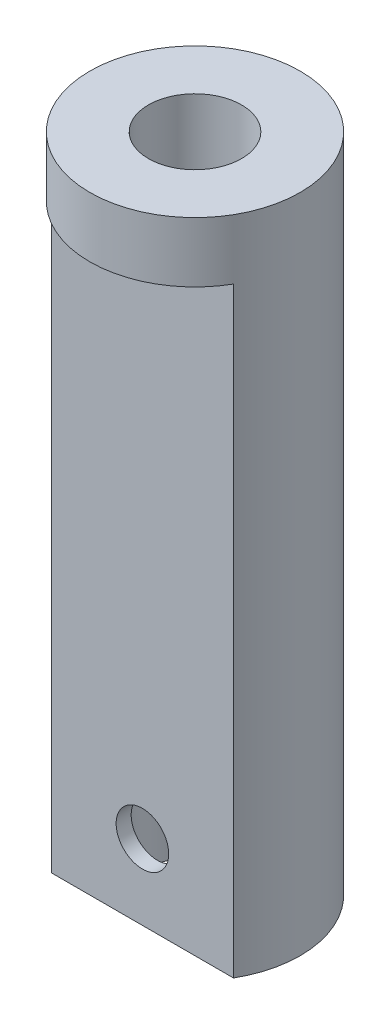
ISO-10303-21;
HEADER;
FILE_DESCRIPTION(('STEP AP214'),'2;1');
FILE_NAME('part.step','',(''),(''),'','','');
FILE_SCHEMA(('AUTOMOTIVE_DESIGN { 1 0 10303 214 1 1 1 1 }'));
ENDSEC;
DATA;
#1=APPLICATION_CONTEXT('core data for automotive mechanical design processes');
#2=APPLICATION_PROTOCOL_DEFINITION('international standard','automotive_design',2000,#1);
#3=PRODUCT_CONTEXT('',#1,'mechanical');
#4=PRODUCT('Part','Part','',(#3));
#5=PRODUCT_RELATED_PRODUCT_CATEGORY('part','',(#4));
#6=PRODUCT_DEFINITION_FORMATION('','',#4);
#7=PRODUCT_DEFINITION_CONTEXT('part definition',#1,'design');
#8=PRODUCT_DEFINITION('design','',#6,#7);
#9=PRODUCT_DEFINITION_SHAPE('','',#8);
#10=(LENGTH_UNIT() NAMED_UNIT(*) SI_UNIT(.MILLI.,.METRE.));
#11=(NAMED_UNIT(*) PLANE_ANGLE_UNIT() SI_UNIT($,.RADIAN.));
#12=(NAMED_UNIT(*) SI_UNIT($,.STERADIAN.) SOLID_ANGLE_UNIT());
#13=UNCERTAINTY_MEASURE_WITH_UNIT(LENGTH_MEASURE(1.E-05),#10,'distance_accuracy_value','');
#14=(GEOMETRIC_REPRESENTATION_CONTEXT(3) GLOBAL_UNCERTAINTY_ASSIGNED_CONTEXT((#13)) GLOBAL_UNIT_ASSIGNED_CONTEXT((#10,
#11,#12)) REPRESENTATION_CONTEXT('',''));
#15=CARTESIAN_POINT('',(0.,0.,0.));
#16=DIRECTION('',(0.,0.,1.));
#17=DIRECTION('',(1.,0.,0.));
#18=AXIS2_PLACEMENT_3D('',#15,#16,#17);
#19=CARTESIAN_POINT('',(0.,30.,0.));
#20=DIRECTION('',(0.,1.,0.));
#21=DIRECTION('',(0.,0.,1.));
#22=AXIS2_PLACEMENT_3D('',#19,#20,#21);
#23=PLANE('',#22);
#24=DIRECTION('',(1.,0.,0.));
#25=VECTOR('',#24,1.);
#26=CARTESIAN_POINT('',(-1.83303027798234,30.,2.5));
#27=LINE('',#26,#25);
#28=CARTESIAN_POINT('',(-1.83303027798234,30.,2.5));
#29=VERTEX_POINT('',#28);
#30=CARTESIAN_POINT('',(1.83303027798234,30.,2.5));
#31=VERTEX_POINT('',#30);
#32=EDGE_CURVE('E115',#29,#31,#27,.T.);
#33=ORIENTED_EDGE('',*,*,#32,.F.);
#34=CARTESIAN_POINT('',(0.,30.,0.));
#35=DIRECTION('',(0.,1.,0.));
#36=DIRECTION('',(0.,0.,1.));
#37=AXIS2_PLACEMENT_3D('',#34,#35,#36);
#38=CIRCLE('',#37,3.1);
#39=EDGE_CURVE('E11',#29,#31,#38,.T.);
#40=ORIENTED_EDGE('',*,*,#39,.T.);
#41=EDGE_LOOP('',(#33,#40));
#42=FACE_BOUND('',#41,.T.);
#43=ADVANCED_FACE('F33',(#42),#23,.T.);
#44=CARTESIAN_POINT('',(0.,30.,0.));
#45=DIRECTION('',(0.,-1.,0.));
#46=DIRECTION('',(0.,0.,-1.));
#47=AXIS2_PLACEMENT_3D('',#44,#45,#46);
#48=CYLINDRICAL_SURFACE('',#47,7.);
#49=CARTESIAN_POINT('',(0.,-3.25,-7.));
#50=CARTESIAN_POINT('',(-0.0966887701146864,-3.25000271336119,-6.99999836512681));
#51=CARTESIAN_POINT('',(-0.193407850802557,-3.25804014256942,-6.99797674487133));
#52=CARTESIAN_POINT('',(-0.384074044398955,-3.28992934319151,-6.99010799468208));
#53=CARTESIAN_POINT('',(-0.478019554682529,-3.31379007779416,-6.9842586965663));
#54=CARTESIAN_POINT('',(-0.660357684213006,-3.37651246237244,-6.96938230720713));
#55=CARTESIAN_POINT('',(-0.74875682400167,-3.41535609850116,-6.96035903315768));
#56=CARTESIAN_POINT('',(-0.917784153888497,-3.50687828838564,-6.94009567775525));
#57=CARTESIAN_POINT('',(-0.998412081740218,-3.55955730880543,-6.92885552163059));
#58=CARTESIAN_POINT('',(-1.15126891518441,-3.67840092126325,-6.90511982523768));
#59=CARTESIAN_POINT('',(-1.22331497173792,-3.74479683745238,-6.89260491673288));
#60=CARTESIAN_POINT('',(-1.35537374840385,-3.8886942390604,-6.86785890137118));
#61=CARTESIAN_POINT('',(-1.41538510977399,-3.96619697677091,-6.8556278266974));
#62=CARTESIAN_POINT('',(-1.52253096659887,-4.13152776452701,-6.83263904982995));
#63=CARTESIAN_POINT('',(-1.56946091857958,-4.21949210261214,-6.82190593549039));
#64=CARTESIAN_POINT('',(-1.64779639330895,-4.40237314693475,-6.80341077280927));
#65=CARTESIAN_POINT('',(-1.67920439801255,-4.49728873888006,-6.79564824951587));
#66=CARTESIAN_POINT('',(-1.72498064293834,-4.68936741456955,-6.78417222837143));
#67=CARTESIAN_POINT('',(-1.73967764638889,-4.78644737872477,-6.7803807292133));
#68=CARTESIAN_POINT('',(-1.75263873757916,-4.98176333051631,-6.77704256294031));
#69=CARTESIAN_POINT('',(-1.75090549878764,-5.07999912748171,-6.77749520523418));
#70=CARTESIAN_POINT('',(-1.73131761207916,-5.27231844236856,-6.78252406412721));
#71=CARTESIAN_POINT('',(-1.71385473022227,-5.36644489170928,-6.78700006835526));
#72=CARTESIAN_POINT('',(-1.66392821805362,-5.55038789272984,-6.79941161289231));
#73=CARTESIAN_POINT('',(-1.63146351908099,-5.64020413686715,-6.80734739965812));
#74=CARTESIAN_POINT('',(-1.55212105759335,-5.81402768562741,-6.82587632888218));
#75=CARTESIAN_POINT('',(-1.50510111177173,-5.89796720042115,-6.83649548714325));
#76=CARTESIAN_POINT('',(-1.39808232201745,-6.05690516138298,-6.8591799598745));
#77=CARTESIAN_POINT('',(-1.33808120694364,-6.1319020394118,-6.87124552723858));
#78=CARTESIAN_POINT('',(-1.20477399546142,-6.2730708849768,-6.89588527296411));
#79=CARTESIAN_POINT('',(-1.1311373011935,-6.33893023840491,-6.90846414390967));
#80=CARTESIAN_POINT('',(-0.973713903754316,-6.45742478287456,-6.9324029317525));
#81=CARTESIAN_POINT('',(-0.889926890659268,-6.51005956997416,-6.94376281140985));
#82=CARTESIAN_POINT('',(-0.714135203461624,-6.60072568392845,-6.96404020776546));
#83=CARTESIAN_POINT('',(-0.622103292076728,-6.63870623029683,-6.97294920149013));
#84=CARTESIAN_POINT('',(-0.432688676166697,-6.6985701899945,-6.98725903156655));
#85=CARTESIAN_POINT('',(-0.3353069990089,-6.72045668248783,-6.99266053895828));
#86=CARTESIAN_POINT('',(-0.140629965455032,-6.74703382648531,-6.99924749149937));
#87=CARTESIAN_POINT('',(-0.0433961733195787,-6.75215019708785,-7.00053729092992));
#88=CARTESIAN_POINT('',(0.150538353935092,-6.74620949760193,-6.99905272283526));
#89=CARTESIAN_POINT('',(0.247239136252027,-6.73515388340101,-6.99627872115488));
#90=CARTESIAN_POINT('',(0.435883313572573,-6.69753394021006,-6.9870451131525));
#91=CARTESIAN_POINT('',(0.527875972130213,-6.67120185927685,-6.9806407321678));
#92=CARTESIAN_POINT('',(0.706133507861262,-6.60404173530015,-6.96486824406489));
#93=CARTESIAN_POINT('',(0.792397805538073,-6.5632122283013,-6.95549983764874));
#94=CARTESIAN_POINT('',(0.958443656834821,-6.46739118297948,-6.93458859247362));
#95=CARTESIAN_POINT('',(1.03808301547513,-6.41216120220378,-6.92301011928087));
#96=CARTESIAN_POINT('',(1.18711438258379,-6.2894117730702,-6.89901927385322));
#97=CARTESIAN_POINT('',(1.25650461880184,-6.22189020378028,-6.88660675793656));
#98=CARTESIAN_POINT('',(1.38482232941818,-6.07449771234813,-6.86197116454233));
#99=CARTESIAN_POINT('',(1.44345117889237,-5.99436434649718,-6.84976021551828));
#100=CARTESIAN_POINT('',(1.54642921884815,-5.82514525979,-6.82725024773445));
#101=CARTESIAN_POINT('',(1.59077904318426,-5.73605993654696,-6.8169511441153));
#102=CARTESIAN_POINT('',(1.66360999071084,-5.55194332385141,-6.79954443857109));
#103=CARTESIAN_POINT('',(1.69218512942974,-5.45695110026532,-6.79241797840557));
#104=CARTESIAN_POINT('',(1.73290326994607,-5.26330542246271,-6.78214534771881));
#105=CARTESIAN_POINT('',(1.74504986539177,-5.16465277379543,-6.77899830673259));
#106=CARTESIAN_POINT('',(1.75237835538966,-4.96952547216893,-6.77710718071283));
#107=CARTESIAN_POINT('',(1.74803754741014,-4.87306965902115,-6.77823921516308));
#108=CARTESIAN_POINT('',(1.72360682469834,-4.68231212988736,-6.78449227175816));
#109=CARTESIAN_POINT('',(1.7035172264679,-4.58801037065074,-6.78961321373833));
#110=CARTESIAN_POINT('',(1.64841987268326,-4.40475679775703,-6.80319804129843));
#111=CARTESIAN_POINT('',(1.61350163879377,-4.31577647721976,-6.81164184442361));
#112=CARTESIAN_POINT('',(1.52980906587258,-4.14487372016736,-6.83092381678967));
#113=CARTESIAN_POINT('',(1.48103280503989,-4.06295226461527,-6.84176231807569));
#114=CARTESIAN_POINT('',(1.36951237340999,-3.90618626616431,-6.86496573307431));
#115=CARTESIAN_POINT('',(1.30643702339763,-3.83158208100538,-6.87736308970383));
#116=CARTESIAN_POINT('',(1.16875426638802,-3.69386178107203,-6.90209365120667));
#117=CARTESIAN_POINT('',(1.09414412480467,-3.63074839820154,-6.91442684014903));
#118=CARTESIAN_POINT('',(0.933878851153022,-3.51668680667463,-6.93790598255607));
#119=CARTESIAN_POINT('',(0.848048159369118,-3.46597961738316,-6.94902638926846));
#120=CARTESIAN_POINT('',(0.668810402762223,-3.37979462656938,-6.96855745804305));
#121=CARTESIAN_POINT('',(0.57540882400953,-3.34430591257671,-6.97697006066411));
#122=CARTESIAN_POINT('',(0.401811962117385,-3.29483286461541,-6.98889402826465));
#123=CARTESIAN_POINT('',(0.322443532726081,-3.27805688310433,-6.99303015894806));
#124=CARTESIAN_POINT('',(0.162057083458997,-3.25563973244107,-6.99858372770606));
#125=CARTESIAN_POINT('',(0.0810391881163858,-3.24999772581049,-7.00000137026043));
#126=CARTESIAN_POINT('',(0.,-3.25,-7.));
#127=B_SPLINE_CURVE_WITH_KNOTS('',3,(#49,#50,#51,#52,#53,#54,#55,#56,#57,#58,#59,#60,#61,#62,
#63,#64,#65,#66,#67,#68,#69,#70,#71,#72,#73,#74,#75,#76,#77,#78,#79,#80,#81,#82,#83,#84,#85,#86,
#87,#88,#89,#90,#91,#92,#93,#94,#95,#96,#97,#98,#99,#100,#101,#102,#103,#104,#105,#106,#107,
#108,#109,#110,#111,#112,#113,#114,#115,#116,#117,#118,#119,#120,#121,#122,#123,#124,#125,#126),
.UNSPECIFIED.,.T.,.F.,(4,2,2,2,2,2,2,2,2,2,2,2,2,2,2,2,2,2,2,2,2,2,2,2,2,2,2,2,2,2,2,2,2,2,2,2,
2,2,4),(0.,0.289769331217205,0.579702944057882,0.869289052667122,1.15888493019755,
1.45383508009995,1.74881851176739,2.04818422136774,2.34750204697596,2.64082344282669,
2.93409711131479,3.22026246508187,3.50644820710378,3.79552282519526,4.08464805975523,
4.38201751130522,4.67939604484621,4.97779600510633,5.27613885970083,5.56684693774155,
5.85752884631533,6.14390320266377,6.43030648542672,6.7217918549291,7.01332756842689,
7.31201927405222,7.61069771874426,7.90757630383042,8.20438993794476,8.49267743798381,
8.78095914448707,9.06752467319355,9.35412996159718,9.64821172478228,9.9423633139882,
10.2418421641619,10.5411059112491,10.7839928343251,11.0268614871688),.UNSPECIFIED.);
#128=CARTESIAN_POINT('',(0.,-3.25,-7.));
#129=VERTEX_POINT('',#128);
#130=EDGE_CURVE('E92',#129,#129,#127,.T.);
#131=ORIENTED_EDGE('',*,*,#130,.T.);
#132=EDGE_LOOP('',(#131));
#133=FACE_BOUND('',#132,.T.);
#134=DIRECTION('',(0.,-1.,0.));
#135=VECTOR('',#134,1.);
#136=CARTESIAN_POINT('',(6.06217782649107,30.,3.5));
#137=LINE('',#136,#135);
#138=CARTESIAN_POINT('',(6.06217782649107,30.,3.5));
#139=VERTEX_POINT('',#138);
#140=CARTESIAN_POINT('',(6.06217782649107,-10.,3.5));
#141=VERTEX_POINT('',#140);
#142=EDGE_CURVE('E121',#139,#141,#137,.T.);
#143=ORIENTED_EDGE('',*,*,#142,.T.);
#144=CARTESIAN_POINT('',(0.,-10.,0.));
#145=DIRECTION('',(0.,-1.,0.));
#146=DIRECTION('',(0.,0.,-1.));
#147=AXIS2_PLACEMENT_3D('',#144,#145,#146);
#148=CIRCLE('',#147,7.);
#149=CARTESIAN_POINT('',(-6.06217782649107,-10.,3.5));
#150=VERTEX_POINT('',#149);
#151=EDGE_CURVE('E88',#150,#141,#148,.T.);
#152=ORIENTED_EDGE('',*,*,#151,.F.);
#153=DIRECTION('',(0.,-1.,0.));
#154=VECTOR('',#153,1.);
#155=CARTESIAN_POINT('',(-6.06217782649107,30.,3.5));
#156=LINE('',#155,#154);
#157=CARTESIAN_POINT('',(-6.06217782649107,30.,3.5));
#158=VERTEX_POINT('',#157);
#159=EDGE_CURVE('E43',#158,#150,#156,.T.);
#160=ORIENTED_EDGE('',*,*,#159,.F.);
#161=CARTESIAN_POINT('',(0.,30.,0.));
#162=DIRECTION('',(0.,1.,0.));
#163=DIRECTION('',(0.,0.,1.));
#164=AXIS2_PLACEMENT_3D('',#161,#162,#163);
#165=CIRCLE('',#164,7.);
#166=EDGE_CURVE('E110',#158,#139,#165,.T.);
#167=ORIENTED_EDGE('',*,*,#166,.T.);
#168=EDGE_LOOP('',(#143,#152,#160,#167));
#169=FACE_BOUND('',#168,.T.);
#170=CARTESIAN_POINT('',(0.,34.,0.));
#171=DIRECTION('',(0.,1.,0.));
#172=DIRECTION('',(0.,0.,1.));
#173=AXIS2_PLACEMENT_3D('',#170,#171,#172);
#174=CIRCLE('',#173,7.);
#175=CARTESIAN_POINT('',(0.,34.,7.));
#176=VERTEX_POINT('',#175);
#177=EDGE_CURVE('E112',#176,#176,#174,.T.);
#178=ORIENTED_EDGE('',*,*,#177,.F.);
#179=EDGE_LOOP('',(#178));
#180=FACE_BOUND('',#179,.T.);
#181=ADVANCED_FACE('F35',(#133,#169,#180),#48,.T.);
#182=CARTESIAN_POINT('',(-6.06217782649107,30.,3.5));
#183=DIRECTION('',(0.,0.,-1.));
#184=DIRECTION('',(-1.,0.,0.));
#185=AXIS2_PLACEMENT_3D('',#182,#183,#184);
#186=PLANE('',#185);
#187=CARTESIAN_POINT('',(0.,-5.,3.5));
#188=DIRECTION('',(0.,0.,1.));
#189=DIRECTION('',(1.,0.,0.));
#190=AXIS2_PLACEMENT_3D('',#187,#188,#189);
#191=CIRCLE('',#190,1.75);
#192=CARTESIAN_POINT('',(1.75,-5.,3.5));
#193=VERTEX_POINT('',#192);
#194=EDGE_CURVE('E158',#193,#193,#191,.T.);
#195=ORIENTED_EDGE('',*,*,#194,.F.);
#196=EDGE_LOOP('',(#195));
#197=FACE_BOUND('',#196,.T.);
#198=ORIENTED_EDGE('',*,*,#159,.T.);
#199=DIRECTION('',(-1.,0.,0.));
#200=VECTOR('',#199,1.);
#201=CARTESIAN_POINT('',(-6.06217782649107,-10.,3.5));
#202=LINE('',#201,#200);
#203=EDGE_CURVE('E105',#141,#150,#202,.T.);
#204=ORIENTED_EDGE('',*,*,#203,.F.);
#205=ORIENTED_EDGE('',*,*,#142,.F.);
#206=DIRECTION('',(1.,0.,0.));
#207=VECTOR('',#206,1.);
#208=CARTESIAN_POINT('',(-6.06217782649107,30.,3.5));
#209=LINE('',#208,#207);
#210=EDGE_CURVE('E59',#158,#139,#209,.T.);
#211=ORIENTED_EDGE('',*,*,#210,.F.);
#212=EDGE_LOOP('',(#198,#204,#205,#211));
#213=FACE_BOUND('',#212,.T.);
#214=ADVANCED_FACE('F123',(#197,#213),#186,.F.);
#215=CARTESIAN_POINT('',(0.,30.,0.));
#216=DIRECTION('',(0.,-1.,0.));
#217=DIRECTION('',(0.,0.,-1.));
#218=AXIS2_PLACEMENT_3D('',#215,#216,#217);
#219=CYLINDRICAL_SURFACE('',#218,3.1);
#220=CARTESIAN_POINT('',(0.,-3.25,-3.1));
#221=CARTESIAN_POINT('',(-0.0906217192831769,-3.24999521509585,-3.10000420251891));
#222=CARTESIAN_POINT('',(-0.181216357350658,-3.25706869492465,-3.09599361262121));
#223=CARTESIAN_POINT('',(-0.35957780199557,-3.2849634513701,-3.08037600695116));
#224=CARTESIAN_POINT('',(-0.447344414991771,-3.30578566701406,-3.06876847231424));
#225=CARTESIAN_POINT('',(-0.617310726588605,-3.36007134392647,-3.0391370149575));
#226=CARTESIAN_POINT('',(-0.699529692760566,-3.39348808168705,-3.02113682197074));
#227=CARTESIAN_POINT('',(-0.857031711210552,-3.4716887016886,-2.98028939192881));
#228=CARTESIAN_POINT('',(-0.932313034626219,-3.51647540694396,-2.95744095134875));
#229=CARTESIAN_POINT('',(-1.07978906311454,-3.6197013478202,-2.90698346095951));
#230=CARTESIAN_POINT('',(-1.15138593607805,-3.67888371373753,-2.87915167623758));
#231=CARTESIAN_POINT('',(-1.28421331975523,-3.80758166643952,-2.8224144507107));
#232=CARTESIAN_POINT('',(-1.34543279861919,-3.87710810408901,-2.79350790666607));
#233=CARTESIAN_POINT('',(-1.46229411961439,-4.03321120348618,-2.73430465023166));
#234=CARTESIAN_POINT('',(-1.5166665735016,-4.12081276050632,-2.70418289998332));
#235=CARTESIAN_POINT('',(-1.609675881698,-4.3056615942744,-2.64987937042414));
#236=CARTESIAN_POINT('',(-1.64833593628469,-4.40289438395783,-2.62568885440689));
#237=CARTESIAN_POINT('',(-1.70150963094453,-4.58268425377759,-2.59145518002551));
#238=CARTESIAN_POINT('',(-1.71943816550077,-4.66386377114333,-2.57948333998774));
#239=CARTESIAN_POINT('',(-1.74357771038549,-4.82867088468949,-2.56323199559777));
#240=CARTESIAN_POINT('',(-1.74980081806947,-4.91229586262761,-2.55894454977383));
#241=CARTESIAN_POINT('',(-1.75019000557479,-5.0796885933713,-2.55867835879089));
#242=CARTESIAN_POINT('',(-1.74434110099241,-5.16345639450651,-2.56270993963493));
#243=CARTESIAN_POINT('',(-1.72089819107621,-5.32859711971309,-2.57850748792416));
#244=CARTESIAN_POINT('',(-1.70329630726807,-5.40996839907524,-2.59027864342314));
#245=CARTESIAN_POINT('',(-1.657249219719,-5.56815928107951,-2.61997411465452));
#246=CARTESIAN_POINT('',(-1.62882584343232,-5.64498768885038,-2.63788603698261));
#247=CARTESIAN_POINT('',(-1.56211502771627,-5.79303051795028,-2.6779296445262));
#248=CARTESIAN_POINT('',(-1.52382377482534,-5.86424275497209,-2.70006296024663));
#249=CARTESIAN_POINT('',(-1.43152641798009,-6.0108741905123,-2.75025461648012));
#250=CARTESIAN_POINT('',(-1.37599821655095,-6.08520489894433,-2.77869797678232));
#251=CARTESIAN_POINT('',(-1.25396554584119,-6.22418693040083,-2.83586261379248));
#252=CARTESIAN_POINT('',(-1.18745202051661,-6.28883018274362,-2.86458410123713));
#253=CARTESIAN_POINT('',(-1.03668696229015,-6.41363261961068,-2.92275316652969));
#254=CARTESIAN_POINT('',(-0.95129452066087,-6.47254791757168,-2.95194248846239));
#255=CARTESIAN_POINT('',(-0.770019788773486,-6.57492268514377,-3.00432119579068));
#256=CARTESIAN_POINT('',(-0.674144309711802,-6.61839211335483,-3.02751444446835));
#257=CARTESIAN_POINT('',(-0.481557855383652,-6.68530396913505,-3.06382395270728));
#258=CARTESIAN_POINT('',(-0.385375466158948,-6.70993559102553,-3.07753210375159));
#259=CARTESIAN_POINT('',(-0.189407208019869,-6.74254538956774,-3.09576725220434));
#260=CARTESIAN_POINT('',(-0.0896248164390413,-6.75053922096781,-3.10030288006434));
#261=CARTESIAN_POINT('',(0.0980017075441094,-6.74946987576154,-3.09970207643259));
#262=CARTESIAN_POINT('',(0.185867474628648,-6.74230512225347,-3.09564209414477));
#263=CARTESIAN_POINT('',(0.358915658936701,-6.7150365353639,-3.08037695843105));
#264=CARTESIAN_POINT('',(0.444098011144978,-6.69493238873226,-3.06917163202338));
#265=CARTESIAN_POINT('',(0.608959335053683,-6.64289182954784,-3.04074411584778));
#266=CARTESIAN_POINT('',(0.688673862285319,-6.61104263687817,-3.02356633060952));
#267=CARTESIAN_POINT('',(0.841697084178722,-6.53664933816195,-2.9845918539727));
#268=CARTESIAN_POINT('',(0.915004155989898,-6.49410253319069,-2.96279399718413));
#269=CARTESIAN_POINT('',(1.06131590983964,-6.39453651705676,-2.91378805642279));
#270=CARTESIAN_POINT('',(1.13350006162199,-6.33647374278493,-2.8862532905604));
#271=CARTESIAN_POINT('',(1.26766006186162,-6.20998067185974,-2.82990189416845));
#272=CARTESIAN_POINT('',(1.32962423801516,-6.14153868988288,-2.80108384502935));
#273=CARTESIAN_POINT('',(1.4483101193777,-5.98758748461451,-2.74176063331579));
#274=CARTESIAN_POINT('',(1.50376450235781,-5.90103605985907,-2.71140414934628));
#275=CARTESIAN_POINT('',(1.59916222017647,-5.71817542794028,-2.65626254192791));
#276=CARTESIAN_POINT('',(1.63912683182613,-5.62187983648649,-2.63146979596913));
#277=CARTESIAN_POINT('',(1.69500276264145,-5.44304718291583,-2.59573205017385));
#278=CARTESIAN_POINT('',(1.71421311952257,-5.36190572431879,-2.58296753495272));
#279=CARTESIAN_POINT('',(1.74088606523093,-5.19692310268052,-2.56506991649936));
#280=CARTESIAN_POINT('',(1.74836130884322,-5.11308494741002,-2.55992859298443));
#281=CARTESIAN_POINT('',(1.75115719838957,-4.94496880973085,-2.55801730566599));
#282=CARTESIAN_POINT('',(1.74645764108732,-4.86069032815395,-2.56126125662316));
#283=CARTESIAN_POINT('',(1.72514079922644,-4.69433295317237,-2.57566430823171));
#284=CARTESIAN_POINT('',(1.70851590670896,-4.6122554986422,-2.58682846165324));
#285=CARTESIAN_POINT('',(1.66442524342969,-4.45325606964377,-2.61540839414585));
#286=CARTESIAN_POINT('',(1.63707880158631,-4.37628789645685,-2.63275517474297));
#287=CARTESIAN_POINT('',(1.57251492761298,-4.22782238746006,-2.67181908680955));
#288=CARTESIAN_POINT('',(1.53529376812203,-4.15632713064334,-2.69353786780813));
#289=CARTESIAN_POINT('',(1.44546159201793,-4.00921184420538,-2.74292685662782));
#290=CARTESIAN_POINT('',(1.39136788617803,-3.93463148369274,-2.77099932971367));
#291=CARTESIAN_POINT('',(1.27227786041018,-3.79490791318841,-2.827660452016));
#292=CARTESIAN_POINT('',(1.20727262838111,-3.72977249917191,-2.85624950598311));
#293=CARTESIAN_POINT('',(1.05924055689136,-3.60320125507005,-2.91462486754668));
#294=CARTESIAN_POINT('',(0.974999821217386,-3.54305907995676,-2.94416881379112));
#295=CARTESIAN_POINT('',(0.795854843469345,-3.43798849059072,-2.99755431783949));
#296=CARTESIAN_POINT('',(0.700955479625783,-3.39305315397292,-3.02139846881429));
#297=CARTESIAN_POINT('',(0.506832175960588,-3.32194059685541,-3.05982383972062));
#298=CARTESIAN_POINT('',(0.407914528992368,-3.29510893669488,-3.07472578487656));
#299=CARTESIAN_POINT('',(0.205983432409906,-3.25915030897425,-3.09480656105867));
#300=CARTESIAN_POINT('',(0.102974232611706,-3.25000543712741,-3.09999522464191));
#301=CARTESIAN_POINT('',(0.,-3.25,-3.1));
#302=B_SPLINE_CURVE_WITH_KNOTS('',3,(#220,#221,#222,#223,#224,#225,#226,#227,#228,#229,#230,
#231,#232,#233,#234,#235,#236,#237,#238,#239,#240,#241,#242,#243,#244,#245,#246,#247,#248,#249,
#250,#251,#252,#253,#254,#255,#256,#257,#258,#259,#260,#261,#262,#263,#264,#265,#266,#267,#268,
#269,#270,#271,#272,#273,#274,#275,#276,#277,#278,#279,#280,#281,#282,#283,#284,#285,#286,#287,
#288,#289,#290,#291,#292,#293,#294,#295,#296,#297,#298,#299,#300,#301),.UNSPECIFIED.,.T.,.F.,(4,
2,2,2,2,2,2,2,2,2,2,2,2,2,2,2,2,2,2,2,2,2,2,2,2,2,2,2,2,2,2,2,2,2,2,2,2,2,2,2,4),(0.,
0.271466722339989,0.542951987551191,0.813439847569152,1.08399493198328,1.37374349629574,
1.66379817644342,1.98444671591453,2.30462006375227,2.55550701246357,2.80613453109937,
3.05707332860612,3.30818050914895,3.5587838553999,3.80948419344839,4.09945698422441,
4.3896700260172,4.71131421440453,5.03275064739148,5.33167950948762,5.63032697751422,
5.89379305198118,6.15726550494582,6.41881954165163,6.68043963274458,6.96920408004505,
7.25829607704858,7.57827323727303,7.89780930462535,8.14978702574133,8.40149283472429,
8.65361659945996,8.9059013538109,9.15545448836201,9.40510195486016,9.69290505427915,
9.98094437394142,10.3022127318363,10.6233346465512,10.9321173425277,11.2405872946947),.UNSPECIFIED.);
#303=CARTESIAN_POINT('',(0.,-3.25,-3.1));
#304=VERTEX_POINT('',#303);
#305=EDGE_CURVE('E95',#304,#304,#302,.T.);
#306=ORIENTED_EDGE('',*,*,#305,.F.);
#307=EDGE_LOOP('',(#306));
#308=FACE_BOUND('',#307,.T.);
#309=DIRECTION('',(0.,-1.,0.));
#310=VECTOR('',#309,1.);
#311=CARTESIAN_POINT('',(-1.83303027798234,30.,2.5));
#312=LINE('',#311,#310);
#313=CARTESIAN_POINT('',(-1.83303027798234,-10.,2.5));
#314=VERTEX_POINT('',#313);
#315=EDGE_CURVE('E77',#29,#314,#312,.T.);
#316=ORIENTED_EDGE('',*,*,#315,.T.);
#317=CARTESIAN_POINT('',(0.,-10.,0.));
#318=DIRECTION('',(0.,1.,0.));
#319=DIRECTION('',(0.,0.,1.));
#320=AXIS2_PLACEMENT_3D('',#317,#318,#319);
#321=CIRCLE('',#320,3.1);
#322=CARTESIAN_POINT('',(1.83303027798234,-10.,2.5));
#323=VERTEX_POINT('',#322);
#324=EDGE_CURVE('E81',#323,#314,#321,.T.);
#325=ORIENTED_EDGE('',*,*,#324,.F.);
#326=DIRECTION('',(0.,-1.,0.));
#327=VECTOR('',#326,1.);
#328=CARTESIAN_POINT('',(1.83303027798234,30.,2.5));
#329=LINE('',#328,#327);
#330=EDGE_CURVE('E51',#31,#323,#329,.T.);
#331=ORIENTED_EDGE('',*,*,#330,.F.);
#332=ORIENTED_EDGE('',*,*,#39,.F.);
#333=EDGE_LOOP('',(#316,#325,#331,#332));
#334=FACE_BOUND('',#333,.T.);
#335=CARTESIAN_POINT('',(0.,34.,0.));
#336=DIRECTION('',(0.,1.,0.));
#337=DIRECTION('',(0.,0.,1.));
#338=AXIS2_PLACEMENT_3D('',#335,#336,#337);
#339=CIRCLE('',#338,3.1);
#340=CARTESIAN_POINT('',(0.,34.,3.1));
#341=VERTEX_POINT('',#340);
#342=EDGE_CURVE('E108',#341,#341,#339,.T.);
#343=ORIENTED_EDGE('',*,*,#342,.T.);
#344=EDGE_LOOP('',(#343));
#345=FACE_BOUND('',#344,.T.);
#346=ADVANCED_FACE('F78',(#308,#334,#345),#219,.F.);
#347=CARTESIAN_POINT('',(-1.83303027798234,30.,2.5));
#348=DIRECTION('',(0.,0.,-1.));
#349=DIRECTION('',(-1.,0.,0.));
#350=AXIS2_PLACEMENT_3D('',#347,#348,#349);
#351=PLANE('',#350);
#352=CARTESIAN_POINT('',(0.,-5.,2.5));
#353=DIRECTION('',(0.,0.,-1.));
#354=DIRECTION('',(-1.,0.,0.));
#355=AXIS2_PLACEMENT_3D('',#352,#353,#354);
#356=CIRCLE('',#355,1.75);
#357=CARTESIAN_POINT('',(-1.75,-5.,2.5));
#358=VERTEX_POINT('',#357);
#359=EDGE_CURVE('E38',#358,#358,#356,.T.);
#360=ORIENTED_EDGE('',*,*,#359,.F.);
#361=EDGE_LOOP('',(#360));
#362=FACE_BOUND('',#361,.T.);
#363=ORIENTED_EDGE('',*,*,#330,.T.);
#364=DIRECTION('',(1.,0.,0.));
#365=VECTOR('',#364,1.);
#366=CARTESIAN_POINT('',(-1.83303027798234,-10.,2.5));
#367=LINE('',#366,#365);
#368=EDGE_CURVE('E85',#314,#323,#367,.T.);
#369=ORIENTED_EDGE('',*,*,#368,.F.);
#370=ORIENTED_EDGE('',*,*,#315,.F.);
#371=ORIENTED_EDGE('',*,*,#32,.T.);
#372=EDGE_LOOP('',(#363,#369,#370,#371));
#373=FACE_BOUND('',#372,.T.);
#374=ADVANCED_FACE('F86',(#362,#373),#351,.T.);
#375=CARTESIAN_POINT('',(0.,30.,0.));
#376=DIRECTION('',(0.,1.,0.));
#377=DIRECTION('',(0.,0.,1.));
#378=AXIS2_PLACEMENT_3D('',#375,#376,#377);
#379=PLANE('',#378);
#380=ORIENTED_EDGE('',*,*,#166,.F.);
#381=ORIENTED_EDGE('',*,*,#210,.T.);
#382=EDGE_LOOP('',(#380,#381));
#383=FACE_BOUND('',#382,.T.);
#384=ADVANCED_FACE('F129',(#383),#379,.F.);
#385=CARTESIAN_POINT('',(0.,34.,0.));
#386=DIRECTION('',(0.,1.,0.));
#387=DIRECTION('',(0.,0.,1.));
#388=AXIS2_PLACEMENT_3D('',#385,#386,#387);
#389=PLANE('',#388);
#390=ORIENTED_EDGE('',*,*,#177,.T.);
#391=EDGE_LOOP('',(#390));
#392=FACE_BOUND('',#391,.T.);
#393=ORIENTED_EDGE('',*,*,#342,.F.);
#394=EDGE_LOOP('',(#393));
#395=FACE_BOUND('',#394,.T.);
#396=ADVANCED_FACE('F131',(#392,#395),#389,.T.);
#397=CARTESIAN_POINT('',(0.,-10.,0.));
#398=DIRECTION('',(0.,-1.,0.));
#399=DIRECTION('',(0.,0.,-1.));
#400=AXIS2_PLACEMENT_3D('',#397,#398,#399);
#401=PLANE('',#400);
#402=ORIENTED_EDGE('',*,*,#324,.T.);
#403=ORIENTED_EDGE('',*,*,#368,.T.);
#404=EDGE_LOOP('',(#402,#403));
#405=FACE_BOUND('',#404,.T.);
#406=ORIENTED_EDGE('',*,*,#151,.T.);
#407=ORIENTED_EDGE('',*,*,#203,.T.);
#408=EDGE_LOOP('',(#406,#407));
#409=FACE_BOUND('',#408,.T.);
#410=ADVANCED_FACE('F90',(#405,#409),#401,.T.);
#411=CARTESIAN_POINT('',(0.,-5.,-8.5));
#412=DIRECTION('',(0.,0.,1.));
#413=DIRECTION('',(1.,0.,0.));
#414=AXIS2_PLACEMENT_3D('',#411,#412,#413);
#415=CYLINDRICAL_SURFACE('',#414,1.75);
#416=ORIENTED_EDGE('',*,*,#359,.T.);
#417=EDGE_LOOP('',(#416));
#418=FACE_BOUND('',#417,.T.);
#419=ORIENTED_EDGE('',*,*,#194,.T.);
#420=EDGE_LOOP('',(#419));
#421=FACE_BOUND('',#420,.T.);
#422=ADVANCED_FACE('F166',(#418,#421),#415,.F.);
#423=ORIENTED_EDGE('',*,*,#305,.T.);
#424=EDGE_LOOP('',(#423));
#425=FACE_BOUND('',#424,.T.);
#426=ORIENTED_EDGE('',*,*,#130,.F.);
#427=EDGE_LOOP('',(#426));
#428=FACE_BOUND('',#427,.T.);
#429=ADVANCED_FACE('F170',(#425,#428),#415,.F.);
#430=CLOSED_SHELL('',(#43,#181,#214,#346,#374,#384,#396,#410,#422,#429));
#431=MANIFOLD_SOLID_BREP('B2',#430);
#432=ADVANCED_BREP_SHAPE_REPRESENTATION('',(#18,#431),#14);
#433=SHAPE_DEFINITION_REPRESENTATION(#9,#432);
ENDSEC;
END-ISO-10303-21;
